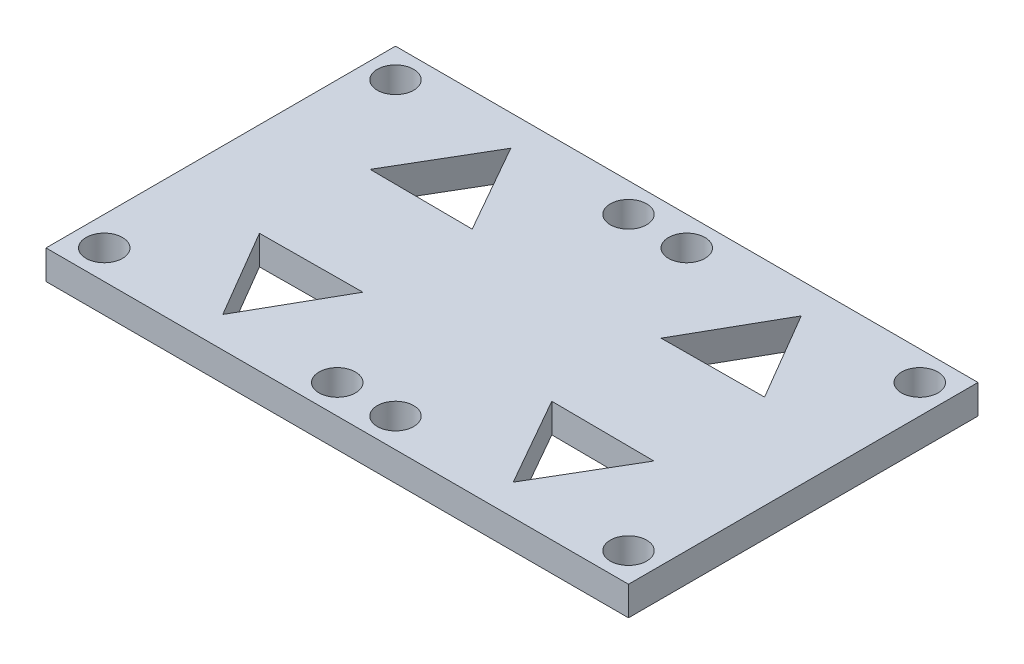
ISO-10303-21;
HEADER;
FILE_DESCRIPTION(('STEP AP214'),'2;1');
FILE_NAME('part.step','',(''),(''),'','','');
FILE_SCHEMA(('AUTOMOTIVE_DESIGN { 1 0 10303 214 1 1 1 1 }'));
ENDSEC;
DATA;
#1=APPLICATION_CONTEXT('core data for automotive mechanical design processes');
#2=APPLICATION_PROTOCOL_DEFINITION('international standard','automotive_design',2000,#1);
#3=PRODUCT_CONTEXT('',#1,'mechanical');
#4=PRODUCT('Part','Part','',(#3));
#5=PRODUCT_RELATED_PRODUCT_CATEGORY('part','',(#4));
#6=PRODUCT_DEFINITION_FORMATION('','',#4);
#7=PRODUCT_DEFINITION_CONTEXT('part definition',#1,'design');
#8=PRODUCT_DEFINITION('design','',#6,#7);
#9=PRODUCT_DEFINITION_SHAPE('','',#8);
#10=(LENGTH_UNIT() NAMED_UNIT(*) SI_UNIT(.MILLI.,.METRE.));
#11=(NAMED_UNIT(*) PLANE_ANGLE_UNIT() SI_UNIT($,.RADIAN.));
#12=(NAMED_UNIT(*) SI_UNIT($,.STERADIAN.) SOLID_ANGLE_UNIT());
#13=UNCERTAINTY_MEASURE_WITH_UNIT(LENGTH_MEASURE(1.E-05),#10,'distance_accuracy_value','');
#14=(GEOMETRIC_REPRESENTATION_CONTEXT(3) GLOBAL_UNCERTAINTY_ASSIGNED_CONTEXT((#13)) GLOBAL_UNIT_ASSIGNED_CONTEXT((#10,
#11,#12)) REPRESENTATION_CONTEXT('',''));
#15=CARTESIAN_POINT('',(0.,0.,0.));
#16=DIRECTION('',(0.,0.,1.));
#17=DIRECTION('',(1.,0.,0.));
#18=AXIS2_PLACEMENT_3D('',#15,#16,#17);
#19=CARTESIAN_POINT('',(0.,25.4,0.));
#20=DIRECTION('',(0.,1.,0.));
#21=DIRECTION('',(0.,0.,1.));
#22=AXIS2_PLACEMENT_3D('',#19,#20,#21);
#23=PLANE('',#22);
#24=DIRECTION('',(0.999976444711515,0.,0.00686367409755204));
#25=VECTOR('',#24,1.);
#26=CARTESIAN_POINT('',(-44.9979325770253,25.4,-48.262777111528));
#27=LINE('',#26,#25);
#28=CARTESIAN_POINT('',(-44.9979325770253,25.4,-48.262777111528));
#29=VERTEX_POINT('',#28);
#30=CARTESIAN_POINT('',(44.6427013174538,25.4,-47.6474985215136));
#31=VERTEX_POINT('',#30);
#32=EDGE_CURVE('E256',#29,#31,#27,.T.);
#33=ORIENTED_EDGE('',*,*,#32,.F.);
#34=DIRECTION('',(-0.505932338487535,0.,0.862573167257441));
#35=VECTOR('',#34,1.);
#36=CARTESIAN_POINT('',(0.355231259571421,25.4,-125.58620398048));
#37=LINE('',#36,#35);
#38=CARTESIAN_POINT('',(0.355231259571421,25.4,-125.58620398048));
#39=VERTEX_POINT('',#38);
#40=EDGE_CURVE('E263',#39,#29,#37,.T.);
#41=ORIENTED_EDGE('',*,*,#40,.F.);
#42=DIRECTION('',(-0.49404410622398,0.,-0.869436841354994));
#43=VECTOR('',#42,1.);
#44=CARTESIAN_POINT('',(44.6427013174538,25.4,-47.6474985215136));
#45=LINE('',#44,#43);
#46=EDGE_CURVE('E271',#31,#39,#45,.T.);
#47=ORIENTED_EDGE('',*,*,#46,.F.);
#48=EDGE_LOOP('',(#33,#41,#47));
#49=FACE_BOUND('',#48,.T.);
#50=DIRECTION('',(-1.,0.,0.));
#51=VECTOR('',#50,1.);
#52=CARTESIAN_POINT('',(0.,25.4,152.4));
#53=LINE('',#52,#51);
#54=CARTESIAN_POINT('',(381.,25.4,152.4));
#55=VERTEX_POINT('',#54);
#56=CARTESIAN_POINT('',(-127.,25.4,152.4));
#57=VERTEX_POINT('',#56);
#58=EDGE_CURVE('E313',#55,#57,#53,.T.);
#59=ORIENTED_EDGE('',*,*,#58,.F.);
#60=DIRECTION('',(0.,0.,-1.));
#61=VECTOR('',#60,1.);
#62=CARTESIAN_POINT('',(381.,25.4,-152.4));
#63=LINE('',#62,#61);
#64=CARTESIAN_POINT('',(381.,25.4,-152.4));
#65=VERTEX_POINT('',#64);
#66=EDGE_CURVE('E220',#55,#65,#63,.T.);
#67=ORIENTED_EDGE('',*,*,#66,.T.);
#68=DIRECTION('',(-1.,0.,0.));
#69=VECTOR('',#68,1.);
#70=CARTESIAN_POINT('',(0.,25.4,-152.4));
#71=LINE('',#70,#69);
#72=CARTESIAN_POINT('',(-127.,25.4,-152.4));
#73=VERTEX_POINT('',#72);
#74=EDGE_CURVE('E11',#65,#73,#71,.T.);
#75=ORIENTED_EDGE('',*,*,#74,.T.);
#76=DIRECTION('',(0.,0.,-1.));
#77=VECTOR('',#76,1.);
#78=CARTESIAN_POINT('',(-127.,25.4,-152.4));
#79=LINE('',#78,#77);
#80=EDGE_CURVE('E298',#57,#73,#79,.T.);
#81=ORIENTED_EDGE('',*,*,#80,.F.);
#82=EDGE_LOOP('',(#59,#67,#75,#81));
#83=FACE_BOUND('',#82,.T.);
#84=CARTESIAN_POINT('',(101.6,25.4,-127.));
#85=DIRECTION('',(0.,1.,0.));
#86=DIRECTION('',(0.,0.,1.));
#87=AXIS2_PLACEMENT_3D('',#84,#85,#86);
#88=CIRCLE('',#87,15.875);
#89=CARTESIAN_POINT('',(101.6,25.4,-111.125));
#90=VERTEX_POINT('',#89);
#91=EDGE_CURVE('E317',#90,#90,#88,.T.);
#92=ORIENTED_EDGE('',*,*,#91,.F.);
#93=EDGE_LOOP('',(#92));
#94=FACE_BOUND('',#93,.T.);
#95=CARTESIAN_POINT('',(101.6,25.4,127.));
#96=DIRECTION('',(0.,-1.,0.));
#97=DIRECTION('',(0.,0.,-1.));
#98=AXIS2_PLACEMENT_3D('',#95,#96,#97);
#99=CIRCLE('',#98,15.875);
#100=CARTESIAN_POINT('',(101.6,25.4,111.125));
#101=VERTEX_POINT('',#100);
#102=EDGE_CURVE('E307',#101,#101,#99,.T.);
#103=ORIENTED_EDGE('',*,*,#102,.T.);
#104=EDGE_LOOP('',(#103));
#105=FACE_BOUND('',#104,.T.);
#106=CARTESIAN_POINT('',(-101.6,25.4,-127.));
#107=DIRECTION('',(0.,-1.,0.));
#108=DIRECTION('',(0.,0.,1.));
#109=AXIS2_PLACEMENT_3D('',#106,#107,#108);
#110=CIRCLE('',#109,15.875);
#111=CARTESIAN_POINT('',(-101.6,25.4,-111.125));
#112=VERTEX_POINT('',#111);
#113=EDGE_CURVE('E292',#112,#112,#110,.T.);
#114=ORIENTED_EDGE('',*,*,#113,.T.);
#115=EDGE_LOOP('',(#114));
#116=FACE_BOUND('',#115,.T.);
#117=CARTESIAN_POINT('',(-101.6,25.4,127.));
#118=DIRECTION('',(0.,1.,0.));
#119=DIRECTION('',(0.,0.,-1.));
#120=AXIS2_PLACEMENT_3D('',#117,#118,#119);
#121=CIRCLE('',#120,15.875);
#122=CARTESIAN_POINT('',(-101.6,25.4,111.125));
#123=VERTEX_POINT('',#122);
#124=EDGE_CURVE('E283',#123,#123,#121,.T.);
#125=ORIENTED_EDGE('',*,*,#124,.F.);
#126=EDGE_LOOP('',(#125));
#127=FACE_BOUND('',#126,.T.);
#128=DIRECTION('',(-0.505932338487535,0.,-0.862573167257441));
#129=VECTOR('',#128,1.);
#130=CARTESIAN_POINT('',(0.355231259571421,25.4,125.58620398048));
#131=LINE('',#130,#129);
#132=CARTESIAN_POINT('',(0.355231259571421,25.4,125.58620398048));
#133=VERTEX_POINT('',#132);
#134=CARTESIAN_POINT('',(-44.9979325770253,25.4,48.262777111528));
#135=VERTEX_POINT('',#134);
#136=EDGE_CURVE('E249',#133,#135,#131,.T.);
#137=ORIENTED_EDGE('',*,*,#136,.T.);
#138=DIRECTION('',(0.999976444711515,0.,-0.00686367409755204));
#139=VECTOR('',#138,1.);
#140=CARTESIAN_POINT('',(-44.9979325770253,25.4,48.262777111528));
#141=LINE('',#140,#139);
#142=CARTESIAN_POINT('',(44.6427013174538,25.4,47.6474985215136));
#143=VERTEX_POINT('',#142);
#144=EDGE_CURVE('E48',#135,#143,#141,.T.);
#145=ORIENTED_EDGE('',*,*,#144,.T.);
#146=DIRECTION('',(-0.49404410622398,0.,0.869436841354994));
#147=VECTOR('',#146,1.);
#148=CARTESIAN_POINT('',(44.6427013174538,25.4,47.6474985215136));
#149=LINE('',#148,#147);
#150=EDGE_CURVE('E243',#143,#133,#149,.T.);
#151=ORIENTED_EDGE('',*,*,#150,.T.);
#152=EDGE_LOOP('',(#137,#145,#151));
#153=FACE_BOUND('',#152,.T.);
#154=DIRECTION('',(-0.999976444711515,0.,0.00686367409755204));
#155=VECTOR('',#154,1.);
#156=CARTESIAN_POINT('',(298.997932577025,25.4,-48.262777111528));
#157=LINE('',#156,#155);
#158=CARTESIAN_POINT('',(298.997932577025,25.4,-48.262777111528));
#159=VERTEX_POINT('',#158);
#160=CARTESIAN_POINT('',(209.357298682546,25.4,-47.6474985215136));
#161=VERTEX_POINT('',#160);
#162=EDGE_CURVE('E179',#159,#161,#157,.T.);
#163=ORIENTED_EDGE('',*,*,#162,.T.);
#164=DIRECTION('',(0.49404410622398,0.,-0.869436841354994));
#165=VECTOR('',#164,1.);
#166=CARTESIAN_POINT('',(209.357298682546,25.4,-47.6474985215136));
#167=LINE('',#166,#165);
#168=CARTESIAN_POINT('',(253.644768740429,25.4,-125.58620398048));
#169=VERTEX_POINT('',#168);
#170=EDGE_CURVE('E194',#161,#169,#167,.T.);
#171=ORIENTED_EDGE('',*,*,#170,.T.);
#172=DIRECTION('',(0.505932338487535,0.,0.862573167257441));
#173=VECTOR('',#172,1.);
#174=CARTESIAN_POINT('',(253.644768740429,25.4,-125.58620398048));
#175=LINE('',#174,#173);
#176=EDGE_CURVE('E185',#169,#159,#175,.T.);
#177=ORIENTED_EDGE('',*,*,#176,.T.);
#178=EDGE_LOOP('',(#163,#171,#177));
#179=FACE_BOUND('',#178,.T.);
#180=CARTESIAN_POINT('',(152.4,25.4,-127.));
#181=DIRECTION('',(0.,-1.,0.));
#182=DIRECTION('',(0.,0.,1.));
#183=AXIS2_PLACEMENT_3D('',#180,#181,#182);
#184=CIRCLE('',#183,15.875);
#185=CARTESIAN_POINT('',(152.4,25.4,-111.125));
#186=VERTEX_POINT('',#185);
#187=EDGE_CURVE('E235',#186,#186,#184,.T.);
#188=ORIENTED_EDGE('',*,*,#187,.T.);
#189=EDGE_LOOP('',(#188));
#190=FACE_BOUND('',#189,.T.);
#191=CARTESIAN_POINT('',(152.4,25.4,127.));
#192=DIRECTION('',(0.,1.,0.));
#193=DIRECTION('',(0.,0.,-1.));
#194=AXIS2_PLACEMENT_3D('',#191,#192,#193);
#195=CIRCLE('',#194,15.875);
#196=CARTESIAN_POINT('',(152.4,25.4,111.125));
#197=VERTEX_POINT('',#196);
#198=EDGE_CURVE('E229',#197,#197,#195,.T.);
#199=ORIENTED_EDGE('',*,*,#198,.F.);
#200=EDGE_LOOP('',(#199));
#201=FACE_BOUND('',#200,.T.);
#202=CARTESIAN_POINT('',(355.6,25.4,-127.));
#203=DIRECTION('',(0.,1.,0.));
#204=DIRECTION('',(0.,0.,1.));
#205=AXIS2_PLACEMENT_3D('',#202,#203,#204);
#206=CIRCLE('',#205,15.875);
#207=CARTESIAN_POINT('',(355.6,25.4,-111.125));
#208=VERTEX_POINT('',#207);
#209=EDGE_CURVE('E214',#208,#208,#206,.T.);
#210=ORIENTED_EDGE('',*,*,#209,.F.);
#211=EDGE_LOOP('',(#210));
#212=FACE_BOUND('',#211,.T.);
#213=CARTESIAN_POINT('',(355.6,25.4,127.));
#214=DIRECTION('',(0.,-1.,0.));
#215=DIRECTION('',(0.,0.,-1.));
#216=AXIS2_PLACEMENT_3D('',#213,#214,#215);
#217=CIRCLE('',#216,15.875);
#218=CARTESIAN_POINT('',(355.6,25.4,111.125));
#219=VERTEX_POINT('',#218);
#220=EDGE_CURVE('E205',#219,#219,#217,.T.);
#221=ORIENTED_EDGE('',*,*,#220,.T.);
#222=EDGE_LOOP('',(#221));
#223=FACE_BOUND('',#222,.T.);
#224=DIRECTION('',(0.505932338487535,0.,-0.862573167257441));
#225=VECTOR('',#224,1.);
#226=CARTESIAN_POINT('',(253.644768740429,25.4,125.58620398048));
#227=LINE('',#226,#225);
#228=CARTESIAN_POINT('',(253.644768740429,25.4,125.58620398048));
#229=VERTEX_POINT('',#228);
#230=CARTESIAN_POINT('',(298.997932577025,25.4,48.262777111528));
#231=VERTEX_POINT('',#230);
#232=EDGE_CURVE('E153',#229,#231,#227,.T.);
#233=ORIENTED_EDGE('',*,*,#232,.F.);
#234=DIRECTION('',(0.49404410622398,0.,0.869436841354994));
#235=VECTOR('',#234,1.);
#236=CARTESIAN_POINT('',(209.357298682546,25.4,47.6474985215136));
#237=LINE('',#236,#235);
#238=CARTESIAN_POINT('',(209.357298682546,25.4,47.6474985215136));
#239=VERTEX_POINT('',#238);
#240=EDGE_CURVE('E169',#239,#229,#237,.T.);
#241=ORIENTED_EDGE('',*,*,#240,.F.);
#242=DIRECTION('',(-0.999976444711515,0.,-0.00686367409755204));
#243=VECTOR('',#242,1.);
#244=CARTESIAN_POINT('',(298.997932577025,25.4,48.262777111528));
#245=LINE('',#244,#243);
#246=EDGE_CURVE('E175',#231,#239,#245,.T.);
#247=ORIENTED_EDGE('',*,*,#246,.F.);
#248=EDGE_LOOP('',(#233,#241,#247));
#249=FACE_BOUND('',#248,.T.);
#250=ADVANCED_FACE('F33',(#49,#83,#94,#105,#116,#127,#153,#179,#190,#201,#212,#223,#249),#23,.T.);
#251=CARTESIAN_POINT('',(0.,0.,0.));
#252=DIRECTION('',(0.,1.,0.));
#253=DIRECTION('',(0.,0.,1.));
#254=AXIS2_PLACEMENT_3D('',#251,#252,#253);
#255=PLANE('',#254);
#256=CARTESIAN_POINT('',(-101.6,0.,127.));
#257=DIRECTION('',(0.,1.,0.));
#258=DIRECTION('',(0.,0.,-1.));
#259=AXIS2_PLACEMENT_3D('',#256,#257,#258);
#260=CIRCLE('',#259,15.875);
#261=CARTESIAN_POINT('',(-101.6,0.,111.125));
#262=VERTEX_POINT('',#261);
#263=EDGE_CURVE('E278',#262,#262,#260,.T.);
#264=ORIENTED_EDGE('',*,*,#263,.T.);
#265=EDGE_LOOP('',(#264));
#266=FACE_BOUND('',#265,.T.);
#267=CARTESIAN_POINT('',(-101.6,0.,-127.));
#268=DIRECTION('',(0.,-1.,0.));
#269=DIRECTION('',(0.,0.,1.));
#270=AXIS2_PLACEMENT_3D('',#267,#268,#269);
#271=CIRCLE('',#270,15.875);
#272=CARTESIAN_POINT('',(-101.6,0.,-111.125));
#273=VERTEX_POINT('',#272);
#274=EDGE_CURVE('E291',#273,#273,#271,.T.);
#275=ORIENTED_EDGE('',*,*,#274,.F.);
#276=EDGE_LOOP('',(#275));
#277=FACE_BOUND('',#276,.T.);
#278=CARTESIAN_POINT('',(101.6,0.,127.));
#279=DIRECTION('',(0.,-1.,0.));
#280=DIRECTION('',(0.,0.,-1.));
#281=AXIS2_PLACEMENT_3D('',#278,#279,#280);
#282=CIRCLE('',#281,15.875);
#283=CARTESIAN_POINT('',(101.6,0.,111.125));
#284=VERTEX_POINT('',#283);
#285=EDGE_CURVE('E306',#284,#284,#282,.T.);
#286=ORIENTED_EDGE('',*,*,#285,.F.);
#287=EDGE_LOOP('',(#286));
#288=FACE_BOUND('',#287,.T.);
#289=CARTESIAN_POINT('',(101.6,0.,-127.));
#290=DIRECTION('',(0.,1.,0.));
#291=DIRECTION('',(0.,0.,1.));
#292=AXIS2_PLACEMENT_3D('',#289,#290,#291);
#293=CIRCLE('',#292,15.875);
#294=CARTESIAN_POINT('',(101.6,0.,-111.125));
#295=VERTEX_POINT('',#294);
#296=EDGE_CURVE('E315',#295,#295,#293,.T.);
#297=ORIENTED_EDGE('',*,*,#296,.T.);
#298=EDGE_LOOP('',(#297));
#299=FACE_BOUND('',#298,.T.);
#300=DIRECTION('',(-1.,0.,0.));
#301=VECTOR('',#300,1.);
#302=CARTESIAN_POINT('',(0.,0.,-152.4));
#303=LINE('',#302,#301);
#304=CARTESIAN_POINT('',(381.,0.,-152.4));
#305=VERTEX_POINT('',#304);
#306=CARTESIAN_POINT('',(-127.,0.,-152.4));
#307=VERTEX_POINT('',#306);
#308=EDGE_CURVE('E37',#305,#307,#303,.T.);
#309=ORIENTED_EDGE('',*,*,#308,.F.);
#310=DIRECTION('',(0.,0.,-1.));
#311=VECTOR('',#310,1.);
#312=CARTESIAN_POINT('',(381.,0.,-152.4));
#313=LINE('',#312,#311);
#314=CARTESIAN_POINT('',(381.,0.,152.4));
#315=VERTEX_POINT('',#314);
#316=EDGE_CURVE('E217',#315,#305,#313,.T.);
#317=ORIENTED_EDGE('',*,*,#316,.F.);
#318=DIRECTION('',(-1.,0.,0.));
#319=VECTOR('',#318,1.);
#320=CARTESIAN_POINT('',(0.,0.,152.4));
#321=LINE('',#320,#319);
#322=CARTESIAN_POINT('',(-127.,0.,152.4));
#323=VERTEX_POINT('',#322);
#324=EDGE_CURVE('E310',#315,#323,#321,.T.);
#325=ORIENTED_EDGE('',*,*,#324,.T.);
#326=DIRECTION('',(0.,0.,-1.));
#327=VECTOR('',#326,1.);
#328=CARTESIAN_POINT('',(-127.,0.,-152.4));
#329=LINE('',#328,#327);
#330=EDGE_CURVE('E295',#323,#307,#329,.T.);
#331=ORIENTED_EDGE('',*,*,#330,.T.);
#332=EDGE_LOOP('',(#309,#317,#325,#331));
#333=FACE_BOUND('',#332,.T.);
#334=DIRECTION('',(-0.505932338487535,0.,0.862573167257441));
#335=VECTOR('',#334,1.);
#336=CARTESIAN_POINT('',(0.355231259571421,0.,-125.58620398048));
#337=LINE('',#336,#335);
#338=CARTESIAN_POINT('',(0.355231259571417,0.,-125.58620398048));
#339=VERTEX_POINT('',#338);
#340=CARTESIAN_POINT('',(-44.9979325770253,0.,-48.262777111528));
#341=VERTEX_POINT('',#340);
#342=EDGE_CURVE('E266',#339,#341,#337,.T.);
#343=ORIENTED_EDGE('',*,*,#342,.T.);
#344=DIRECTION('',(0.999976444711515,0.,0.00686367409755204));
#345=VECTOR('',#344,1.);
#346=CARTESIAN_POINT('',(-44.9979325770253,0.,-48.262777111528));
#347=LINE('',#346,#345);
#348=CARTESIAN_POINT('',(44.6427013174538,0.,-47.6474985215136));
#349=VERTEX_POINT('',#348);
#350=EDGE_CURVE('E259',#341,#349,#347,.T.);
#351=ORIENTED_EDGE('',*,*,#350,.T.);
#352=DIRECTION('',(-0.49404410622398,0.,-0.869436841354994));
#353=VECTOR('',#352,1.);
#354=CARTESIAN_POINT('',(44.6427013174538,0.,-47.6474985215136));
#355=LINE('',#354,#353);
#356=EDGE_CURVE('E262',#349,#339,#355,.T.);
#357=ORIENTED_EDGE('',*,*,#356,.T.);
#358=EDGE_LOOP('',(#343,#351,#357));
#359=FACE_BOUND('',#358,.T.);
#360=DIRECTION('',(0.999976444711515,0.,-0.00686367409755204));
#361=VECTOR('',#360,1.);
#362=CARTESIAN_POINT('',(-44.9979325770253,0.,48.262777111528));
#363=LINE('',#362,#361);
#364=CARTESIAN_POINT('',(-44.9979325770253,0.,48.262777111528));
#365=VERTEX_POINT('',#364);
#366=CARTESIAN_POINT('',(44.6427013174538,0.,47.6474985215136));
#367=VERTEX_POINT('',#366);
#368=EDGE_CURVE('E240',#365,#367,#363,.T.);
#369=ORIENTED_EDGE('',*,*,#368,.F.);
#370=DIRECTION('',(-0.505932338487535,0.,-0.862573167257441));
#371=VECTOR('',#370,1.);
#372=CARTESIAN_POINT('',(0.355231259571421,0.,125.58620398048));
#373=LINE('',#372,#371);
#374=CARTESIAN_POINT('',(0.355231259571424,0.,125.58620398048));
#375=VERTEX_POINT('',#374);
#376=EDGE_CURVE('E242',#375,#365,#373,.T.);
#377=ORIENTED_EDGE('',*,*,#376,.F.);
#378=DIRECTION('',(-0.49404410622398,0.,0.869436841354994));
#379=VECTOR('',#378,1.);
#380=CARTESIAN_POINT('',(44.6427013174538,0.,47.6474985215136));
#381=LINE('',#380,#379);
#382=EDGE_CURVE('E245',#367,#375,#381,.T.);
#383=ORIENTED_EDGE('',*,*,#382,.F.);
#384=EDGE_LOOP('',(#369,#377,#383));
#385=FACE_BOUND('',#384,.T.);
#386=CARTESIAN_POINT('',(355.6,0.,127.));
#387=DIRECTION('',(0.,-1.,0.));
#388=DIRECTION('',(0.,0.,-1.));
#389=AXIS2_PLACEMENT_3D('',#386,#387,#388);
#390=CIRCLE('',#389,15.875);
#391=CARTESIAN_POINT('',(355.6,0.,111.125));
#392=VERTEX_POINT('',#391);
#393=EDGE_CURVE('E201',#392,#392,#390,.T.);
#394=ORIENTED_EDGE('',*,*,#393,.F.);
#395=EDGE_LOOP('',(#394));
#396=FACE_BOUND('',#395,.T.);
#397=CARTESIAN_POINT('',(355.6,0.,-127.));
#398=DIRECTION('',(0.,1.,0.));
#399=DIRECTION('',(0.,0.,1.));
#400=AXIS2_PLACEMENT_3D('',#397,#398,#399);
#401=CIRCLE('',#400,15.875);
#402=CARTESIAN_POINT('',(355.6,0.,-111.125));
#403=VERTEX_POINT('',#402);
#404=EDGE_CURVE('E213',#403,#403,#401,.T.);
#405=ORIENTED_EDGE('',*,*,#404,.T.);
#406=EDGE_LOOP('',(#405));
#407=FACE_BOUND('',#406,.T.);
#408=CARTESIAN_POINT('',(152.4,0.,127.));
#409=DIRECTION('',(0.,1.,0.));
#410=DIRECTION('',(0.,0.,-1.));
#411=AXIS2_PLACEMENT_3D('',#408,#409,#410);
#412=CIRCLE('',#411,15.875);
#413=CARTESIAN_POINT('',(152.4,0.,111.125));
#414=VERTEX_POINT('',#413);
#415=EDGE_CURVE('E228',#414,#414,#412,.T.);
#416=ORIENTED_EDGE('',*,*,#415,.T.);
#417=EDGE_LOOP('',(#416));
#418=FACE_BOUND('',#417,.T.);
#419=CARTESIAN_POINT('',(152.4,0.,-127.));
#420=DIRECTION('',(0.,-1.,0.));
#421=DIRECTION('',(0.,0.,1.));
#422=AXIS2_PLACEMENT_3D('',#419,#420,#421);
#423=CIRCLE('',#422,15.875);
#424=CARTESIAN_POINT('',(152.4,0.,-111.125));
#425=VERTEX_POINT('',#424);
#426=EDGE_CURVE('E232',#425,#425,#423,.T.);
#427=ORIENTED_EDGE('',*,*,#426,.F.);
#428=EDGE_LOOP('',(#427));
#429=FACE_BOUND('',#428,.T.);
#430=DIRECTION('',(0.505932338487535,0.,0.862573167257441));
#431=VECTOR('',#430,1.);
#432=CARTESIAN_POINT('',(253.644768740429,0.,-125.58620398048));
#433=LINE('',#432,#431);
#434=CARTESIAN_POINT('',(253.644768740429,0.,-125.58620398048));
#435=VERTEX_POINT('',#434);
#436=CARTESIAN_POINT('',(298.997932577025,0.,-48.262777111528));
#437=VERTEX_POINT('',#436);
#438=EDGE_CURVE('E188',#435,#437,#433,.T.);
#439=ORIENTED_EDGE('',*,*,#438,.F.);
#440=DIRECTION('',(0.49404410622398,0.,-0.869436841354994));
#441=VECTOR('',#440,1.);
#442=CARTESIAN_POINT('',(209.357298682546,0.,-47.6474985215136));
#443=LINE('',#442,#441);
#444=CARTESIAN_POINT('',(209.357298682546,0.,-47.6474985215136));
#445=VERTEX_POINT('',#444);
#446=EDGE_CURVE('E184',#445,#435,#443,.T.);
#447=ORIENTED_EDGE('',*,*,#446,.F.);
#448=DIRECTION('',(-0.999976444711515,0.,0.00686367409755204));
#449=VECTOR('',#448,1.);
#450=CARTESIAN_POINT('',(298.997932577025,0.,-48.262777111528));
#451=LINE('',#450,#449);
#452=EDGE_CURVE('E181',#437,#445,#451,.T.);
#453=ORIENTED_EDGE('',*,*,#452,.F.);
#454=EDGE_LOOP('',(#439,#447,#453));
#455=FACE_BOUND('',#454,.T.);
#456=DIRECTION('',(-0.999976444711515,0.,-0.00686367409755204));
#457=VECTOR('',#456,1.);
#458=CARTESIAN_POINT('',(298.997932577025,0.,48.262777111528));
#459=LINE('',#458,#457);
#460=CARTESIAN_POINT('',(298.997932577025,0.,48.262777111528));
#461=VERTEX_POINT('',#460);
#462=CARTESIAN_POINT('',(209.357298682546,0.,47.6474985215136));
#463=VERTEX_POINT('',#462);
#464=EDGE_CURVE('E164',#461,#463,#459,.T.);
#465=ORIENTED_EDGE('',*,*,#464,.T.);
#466=DIRECTION('',(0.49404410622398,0.,0.869436841354994));
#467=VECTOR('',#466,1.);
#468=CARTESIAN_POINT('',(209.357298682546,0.,47.6474985215136));
#469=LINE('',#468,#467);
#470=CARTESIAN_POINT('',(253.644768740429,0.,125.58620398048));
#471=VERTEX_POINT('',#470);
#472=EDGE_CURVE('E159',#463,#471,#469,.T.);
#473=ORIENTED_EDGE('',*,*,#472,.T.);
#474=DIRECTION('',(0.505932338487535,0.,-0.862573167257441));
#475=VECTOR('',#474,1.);
#476=CARTESIAN_POINT('',(253.644768740429,0.,125.58620398048));
#477=LINE('',#476,#475);
#478=EDGE_CURVE('E150',#471,#461,#477,.T.);
#479=ORIENTED_EDGE('',*,*,#478,.T.);
#480=EDGE_LOOP('',(#465,#473,#479));
#481=FACE_BOUND('',#480,.T.);
#482=ADVANCED_FACE('F163',(#266,#277,#288,#299,#333,#359,#385,#396,#407,#418,#429,#455,#481),
#255,.F.);
#483=CARTESIAN_POINT('',(0.,25.4,-152.4));
#484=DIRECTION('',(0.,0.,1.));
#485=DIRECTION('',(1.,0.,0.));
#486=AXIS2_PLACEMENT_3D('',#483,#484,#485);
#487=PLANE('',#486);
#488=ORIENTED_EDGE('',*,*,#308,.T.);
#489=DIRECTION('',(0.,-1.,0.));
#490=VECTOR('',#489,1.);
#491=CARTESIAN_POINT('',(-127.,25.4,-152.4));
#492=LINE('',#491,#490);
#493=EDGE_CURVE('E301',#73,#307,#492,.T.);
#494=ORIENTED_EDGE('',*,*,#493,.F.);
#495=ORIENTED_EDGE('',*,*,#74,.F.);
#496=DIRECTION('',(0.,-1.,0.));
#497=VECTOR('',#496,1.);
#498=CARTESIAN_POINT('',(381.,25.4,-152.4));
#499=LINE('',#498,#497);
#500=EDGE_CURVE('E223',#65,#305,#499,.T.);
#501=ORIENTED_EDGE('',*,*,#500,.T.);
#502=EDGE_LOOP('',(#488,#494,#495,#501));
#503=FACE_BOUND('',#502,.T.);
#504=ADVANCED_FACE('F35',(#503),#487,.F.);
#505=CARTESIAN_POINT('',(101.6,25.4,-127.));
#506=DIRECTION('',(0.,-1.,0.));
#507=DIRECTION('',(0.,0.,-1.));
#508=AXIS2_PLACEMENT_3D('',#505,#506,#507);
#509=CYLINDRICAL_SURFACE('',#508,15.875);
#510=ORIENTED_EDGE('',*,*,#91,.T.);
#511=EDGE_LOOP('',(#510));
#512=FACE_BOUND('',#511,.T.);
#513=ORIENTED_EDGE('',*,*,#296,.F.);
#514=EDGE_LOOP('',(#513));
#515=FACE_BOUND('',#514,.T.);
#516=ADVANCED_FACE('F325',(#512,#515),#509,.F.);
#517=CARTESIAN_POINT('',(0.,25.4,152.4));
#518=DIRECTION('',(0.,0.,1.));
#519=DIRECTION('',(1.,0.,0.));
#520=AXIS2_PLACEMENT_3D('',#517,#518,#519);
#521=PLANE('',#520);
#522=ORIENTED_EDGE('',*,*,#324,.F.);
#523=DIRECTION('',(0.,-1.,0.));
#524=VECTOR('',#523,1.);
#525=CARTESIAN_POINT('',(381.,25.4,152.4));
#526=LINE('',#525,#524);
#527=EDGE_CURVE('E208',#55,#315,#526,.T.);
#528=ORIENTED_EDGE('',*,*,#527,.F.);
#529=ORIENTED_EDGE('',*,*,#58,.T.);
#530=DIRECTION('',(0.,-1.,0.));
#531=VECTOR('',#530,1.);
#532=CARTESIAN_POINT('',(-127.,25.4,152.4));
#533=LINE('',#532,#531);
#534=EDGE_CURVE('E286',#57,#323,#533,.T.);
#535=ORIENTED_EDGE('',*,*,#534,.T.);
#536=EDGE_LOOP('',(#522,#528,#529,#535));
#537=FACE_BOUND('',#536,.T.);
#538=ADVANCED_FACE('F327',(#537),#521,.T.);
#539=CARTESIAN_POINT('',(101.6,25.4,127.));
#540=DIRECTION('',(0.,-1.,0.));
#541=DIRECTION('',(0.,0.,-1.));
#542=AXIS2_PLACEMENT_3D('',#539,#540,#541);
#543=CYLINDRICAL_SURFACE('',#542,15.875);
#544=ORIENTED_EDGE('',*,*,#102,.F.);
#545=EDGE_LOOP('',(#544));
#546=FACE_BOUND('',#545,.T.);
#547=ORIENTED_EDGE('',*,*,#285,.T.);
#548=EDGE_LOOP('',(#547));
#549=FACE_BOUND('',#548,.T.);
#550=ADVANCED_FACE('F334',(#546,#549),#543,.F.);
#551=CARTESIAN_POINT('',(-127.,25.4,-152.4));
#552=DIRECTION('',(1.,0.,0.));
#553=DIRECTION('',(0.,0.,1.));
#554=AXIS2_PLACEMENT_3D('',#551,#552,#553);
#555=PLANE('',#554);
#556=ORIENTED_EDGE('',*,*,#330,.F.);
#557=ORIENTED_EDGE('',*,*,#534,.F.);
#558=ORIENTED_EDGE('',*,*,#80,.T.);
#559=ORIENTED_EDGE('',*,*,#493,.T.);
#560=EDGE_LOOP('',(#556,#557,#558,#559));
#561=FACE_BOUND('',#560,.T.);
#562=ADVANCED_FACE('F444',(#561),#555,.F.);
#563=CARTESIAN_POINT('',(-101.6,25.4,-127.));
#564=DIRECTION('',(0.,-1.,0.));
#565=DIRECTION('',(0.,0.,-1.));
#566=AXIS2_PLACEMENT_3D('',#563,#564,#565);
#567=CYLINDRICAL_SURFACE('',#566,15.875);
#568=ORIENTED_EDGE('',*,*,#113,.F.);
#569=EDGE_LOOP('',(#568));
#570=FACE_BOUND('',#569,.T.);
#571=ORIENTED_EDGE('',*,*,#274,.T.);
#572=EDGE_LOOP('',(#571));
#573=FACE_BOUND('',#572,.T.);
#574=ADVANCED_FACE('F440',(#570,#573),#567,.F.);
#575=CARTESIAN_POINT('',(-101.6,25.4,127.));
#576=DIRECTION('',(0.,-1.,0.));
#577=DIRECTION('',(0.,0.,-1.));
#578=AXIS2_PLACEMENT_3D('',#575,#576,#577);
#579=CYLINDRICAL_SURFACE('',#578,15.875);
#580=ORIENTED_EDGE('',*,*,#124,.T.);
#581=EDGE_LOOP('',(#580));
#582=FACE_BOUND('',#581,.T.);
#583=ORIENTED_EDGE('',*,*,#263,.F.);
#584=EDGE_LOOP('',(#583));
#585=FACE_BOUND('',#584,.T.);
#586=ADVANCED_FACE('F436',(#582,#585),#579,.F.);
#587=CARTESIAN_POINT('',(-44.9979325770253,0.,-48.262777111528));
#588=DIRECTION('',(-0.00686367409755204,0.,0.999976444711515));
#589=DIRECTION('',(0.999976444711516,0.,0.00686367409755204));
#590=AXIS2_PLACEMENT_3D('',#587,#588,#589);
#591=PLANE('',#590);
#592=ORIENTED_EDGE('',*,*,#32,.T.);
#593=DIRECTION('',(0.,1.,0.));
#594=VECTOR('',#593,1.);
#595=CARTESIAN_POINT('',(44.6427013174538,0.,-47.6474985215136));
#596=LINE('',#595,#594);
#597=EDGE_CURVE('E269',#349,#31,#596,.T.);
#598=ORIENTED_EDGE('',*,*,#597,.F.);
#599=ORIENTED_EDGE('',*,*,#350,.F.);
#600=DIRECTION('',(0.,1.,0.));
#601=VECTOR('',#600,1.);
#602=CARTESIAN_POINT('',(-44.9979325770253,0.,-48.262777111528));
#603=LINE('',#602,#601);
#604=EDGE_CURVE('E276',#341,#29,#603,.T.);
#605=ORIENTED_EDGE('',*,*,#604,.T.);
#606=EDGE_LOOP('',(#592,#598,#599,#605));
#607=FACE_BOUND('',#606,.T.);
#608=ADVANCED_FACE('F429',(#607),#591,.F.);
#609=CARTESIAN_POINT('',(0.355231259571421,0.,-125.58620398048));
#610=DIRECTION('',(-0.862573167257441,0.,-0.505932338487536));
#611=DIRECTION('',(-0.505932338487536,0.,0.862573167257441));
#612=AXIS2_PLACEMENT_3D('',#609,#610,#611);
#613=PLANE('',#612);
#614=ORIENTED_EDGE('',*,*,#40,.T.);
#615=ORIENTED_EDGE('',*,*,#604,.F.);
#616=ORIENTED_EDGE('',*,*,#342,.F.);
#617=DIRECTION('',(0.,1.,0.));
#618=VECTOR('',#617,1.);
#619=CARTESIAN_POINT('',(0.355231259571421,0.,-125.58620398048));
#620=LINE('',#619,#618);
#621=EDGE_CURVE('E279',#339,#39,#620,.T.);
#622=ORIENTED_EDGE('',*,*,#621,.T.);
#623=EDGE_LOOP('',(#614,#615,#616,#622));
#624=FACE_BOUND('',#623,.T.);
#625=ADVANCED_FACE('F426',(#624),#613,.F.);
#626=CARTESIAN_POINT('',(44.6427013174538,0.,-47.6474985215136));
#627=DIRECTION('',(0.869436841354994,0.,-0.49404410622398));
#628=DIRECTION('',(-0.49404410622398,0.,-0.869436841354994));
#629=AXIS2_PLACEMENT_3D('',#626,#627,#628);
#630=PLANE('',#629);
#631=ORIENTED_EDGE('',*,*,#46,.T.);
#632=ORIENTED_EDGE('',*,*,#621,.F.);
#633=ORIENTED_EDGE('',*,*,#356,.F.);
#634=ORIENTED_EDGE('',*,*,#597,.T.);
#635=EDGE_LOOP('',(#631,#632,#633,#634));
#636=FACE_BOUND('',#635,.T.);
#637=ADVANCED_FACE('F425',(#636),#630,.F.);
#638=CARTESIAN_POINT('',(-44.9979325770253,0.,48.262777111528));
#639=DIRECTION('',(0.00686367409755204,0.,0.999976444711515));
#640=DIRECTION('',(0.999976444711516,0.,-0.00686367409755204));
#641=AXIS2_PLACEMENT_3D('',#638,#639,#640);
#642=PLANE('',#641);
#643=ORIENTED_EDGE('',*,*,#144,.F.);
#644=DIRECTION('',(0.,1.,0.));
#645=VECTOR('',#644,1.);
#646=CARTESIAN_POINT('',(-44.9979325770253,0.,48.262777111528));
#647=LINE('',#646,#645);
#648=EDGE_CURVE('E247',#365,#135,#647,.T.);
#649=ORIENTED_EDGE('',*,*,#648,.F.);
#650=ORIENTED_EDGE('',*,*,#368,.T.);
#651=DIRECTION('',(0.,1.,0.));
#652=VECTOR('',#651,1.);
#653=CARTESIAN_POINT('',(44.6427013174538,0.,47.6474985215136));
#654=LINE('',#653,#652);
#655=EDGE_CURVE('E254',#367,#143,#654,.T.);
#656=ORIENTED_EDGE('',*,*,#655,.T.);
#657=EDGE_LOOP('',(#643,#649,#650,#656));
#658=FACE_BOUND('',#657,.T.);
#659=ADVANCED_FACE('F419',(#658),#642,.T.);
#660=CARTESIAN_POINT('',(44.6427013174538,0.,47.6474985215136));
#661=DIRECTION('',(-0.869436841354994,0.,-0.49404410622398));
#662=DIRECTION('',(-0.49404410622398,0.,0.869436841354994));
#663=AXIS2_PLACEMENT_3D('',#660,#661,#662);
#664=PLANE('',#663);
#665=ORIENTED_EDGE('',*,*,#150,.F.);
#666=ORIENTED_EDGE('',*,*,#655,.F.);
#667=ORIENTED_EDGE('',*,*,#382,.T.);
#668=DIRECTION('',(0.,1.,0.));
#669=VECTOR('',#668,1.);
#670=CARTESIAN_POINT('',(0.355231259571421,0.,125.58620398048));
#671=LINE('',#670,#669);
#672=EDGE_CURVE('E56',#375,#133,#671,.T.);
#673=ORIENTED_EDGE('',*,*,#672,.T.);
#674=EDGE_LOOP('',(#665,#666,#667,#673));
#675=FACE_BOUND('',#674,.T.);
#676=ADVANCED_FACE('F416',(#675),#664,.T.);
#677=CARTESIAN_POINT('',(0.355231259571421,0.,125.58620398048));
#678=DIRECTION('',(0.862573167257441,0.,-0.505932338487536));
#679=DIRECTION('',(-0.505932338487536,0.,-0.862573167257441));
#680=AXIS2_PLACEMENT_3D('',#677,#678,#679);
#681=PLANE('',#680);
#682=ORIENTED_EDGE('',*,*,#136,.F.);
#683=ORIENTED_EDGE('',*,*,#672,.F.);
#684=ORIENTED_EDGE('',*,*,#376,.T.);
#685=ORIENTED_EDGE('',*,*,#648,.T.);
#686=EDGE_LOOP('',(#682,#683,#684,#685));
#687=FACE_BOUND('',#686,.T.);
#688=ADVANCED_FACE('F414',(#687),#681,.T.);
#689=CARTESIAN_POINT('',(152.4,25.4,-127.));
#690=DIRECTION('',(0.,-1.,0.));
#691=DIRECTION('',(0.,0.,-1.));
#692=AXIS2_PLACEMENT_3D('',#689,#690,#691);
#693=CYLINDRICAL_SURFACE('',#692,15.875);
#694=ORIENTED_EDGE('',*,*,#187,.F.);
#695=EDGE_LOOP('',(#694));
#696=FACE_BOUND('',#695,.T.);
#697=ORIENTED_EDGE('',*,*,#426,.T.);
#698=EDGE_LOOP('',(#697));
#699=FACE_BOUND('',#698,.T.);
#700=ADVANCED_FACE('F410',(#696,#699),#693,.F.);
#701=CARTESIAN_POINT('',(152.4,25.4,127.));
#702=DIRECTION('',(0.,-1.,0.));
#703=DIRECTION('',(0.,0.,-1.));
#704=AXIS2_PLACEMENT_3D('',#701,#702,#703);
#705=CYLINDRICAL_SURFACE('',#704,15.875);
#706=ORIENTED_EDGE('',*,*,#198,.T.);
#707=EDGE_LOOP('',(#706));
#708=FACE_BOUND('',#707,.T.);
#709=ORIENTED_EDGE('',*,*,#415,.F.);
#710=EDGE_LOOP('',(#709));
#711=FACE_BOUND('',#710,.T.);
#712=ADVANCED_FACE('F406',(#708,#711),#705,.F.);
#713=CARTESIAN_POINT('',(381.,25.4,-152.4));
#714=DIRECTION('',(-1.,0.,0.));
#715=DIRECTION('',(0.,0.,1.));
#716=AXIS2_PLACEMENT_3D('',#713,#714,#715);
#717=PLANE('',#716);
#718=ORIENTED_EDGE('',*,*,#316,.T.);
#719=ORIENTED_EDGE('',*,*,#500,.F.);
#720=ORIENTED_EDGE('',*,*,#66,.F.);
#721=ORIENTED_EDGE('',*,*,#527,.T.);
#722=EDGE_LOOP('',(#718,#719,#720,#721));
#723=FACE_BOUND('',#722,.T.);
#724=ADVANCED_FACE('F402',(#723),#717,.F.);
#725=CARTESIAN_POINT('',(355.6,25.4,-127.));
#726=DIRECTION('',(0.,-1.,0.));
#727=DIRECTION('',(0.,0.,-1.));
#728=AXIS2_PLACEMENT_3D('',#725,#726,#727);
#729=CYLINDRICAL_SURFACE('',#728,15.875);
#730=ORIENTED_EDGE('',*,*,#209,.T.);
#731=EDGE_LOOP('',(#730));
#732=FACE_BOUND('',#731,.T.);
#733=ORIENTED_EDGE('',*,*,#404,.F.);
#734=EDGE_LOOP('',(#733));
#735=FACE_BOUND('',#734,.T.);
#736=ADVANCED_FACE('F398',(#732,#735),#729,.F.);
#737=CARTESIAN_POINT('',(355.6,25.4,127.));
#738=DIRECTION('',(0.,-1.,0.));
#739=DIRECTION('',(0.,0.,-1.));
#740=AXIS2_PLACEMENT_3D('',#737,#738,#739);
#741=CYLINDRICAL_SURFACE('',#740,15.875);
#742=ORIENTED_EDGE('',*,*,#220,.F.);
#743=EDGE_LOOP('',(#742));
#744=FACE_BOUND('',#743,.T.);
#745=ORIENTED_EDGE('',*,*,#393,.T.);
#746=EDGE_LOOP('',(#745));
#747=FACE_BOUND('',#746,.T.);
#748=ADVANCED_FACE('F394',(#744,#747),#741,.F.);
#749=CARTESIAN_POINT('',(298.997932577025,0.,-48.262777111528));
#750=DIRECTION('',(0.00686367409755204,0.,0.999976444711515));
#751=DIRECTION('',(-0.999976444711516,0.,0.00686367409755204));
#752=AXIS2_PLACEMENT_3D('',#749,#750,#751);
#753=PLANE('',#752);
#754=ORIENTED_EDGE('',*,*,#162,.F.);
#755=DIRECTION('',(0.,1.,0.));
#756=VECTOR('',#755,1.);
#757=CARTESIAN_POINT('',(298.997932577025,0.,-48.262777111528));
#758=LINE('',#757,#756);
#759=EDGE_CURVE('E199',#437,#159,#758,.T.);
#760=ORIENTED_EDGE('',*,*,#759,.F.);
#761=ORIENTED_EDGE('',*,*,#452,.T.);
#762=DIRECTION('',(0.,1.,0.));
#763=VECTOR('',#762,1.);
#764=CARTESIAN_POINT('',(209.357298682546,0.,-47.6474985215136));
#765=LINE('',#764,#763);
#766=EDGE_CURVE('E191',#445,#161,#765,.T.);
#767=ORIENTED_EDGE('',*,*,#766,.T.);
#768=EDGE_LOOP('',(#754,#760,#761,#767));
#769=FACE_BOUND('',#768,.T.);
#770=ADVANCED_FACE('F387',(#769),#753,.F.);
#771=CARTESIAN_POINT('',(253.644768740429,0.,-125.58620398048));
#772=DIRECTION('',(0.862573167257441,0.,-0.505932338487536));
#773=DIRECTION('',(0.505932338487536,0.,0.862573167257441));
#774=AXIS2_PLACEMENT_3D('',#771,#772,#773);
#775=PLANE('',#774);
#776=ORIENTED_EDGE('',*,*,#176,.F.);
#777=DIRECTION('',(0.,1.,0.));
#778=VECTOR('',#777,1.);
#779=CARTESIAN_POINT('',(253.644768740429,0.,-125.58620398048));
#780=LINE('',#779,#778);
#781=EDGE_CURVE('E202',#435,#169,#780,.T.);
#782=ORIENTED_EDGE('',*,*,#781,.F.);
#783=ORIENTED_EDGE('',*,*,#438,.T.);
#784=ORIENTED_EDGE('',*,*,#759,.T.);
#785=EDGE_LOOP('',(#776,#782,#783,#784));
#786=FACE_BOUND('',#785,.T.);
#787=ADVANCED_FACE('F384',(#786),#775,.F.);
#788=CARTESIAN_POINT('',(209.357298682546,0.,-47.6474985215136));
#789=DIRECTION('',(-0.869436841354994,0.,-0.49404410622398));
#790=DIRECTION('',(0.49404410622398,0.,-0.869436841354994));
#791=AXIS2_PLACEMENT_3D('',#788,#789,#790);
#792=PLANE('',#791);
#793=ORIENTED_EDGE('',*,*,#170,.F.);
#794=ORIENTED_EDGE('',*,*,#766,.F.);
#795=ORIENTED_EDGE('',*,*,#446,.T.);
#796=ORIENTED_EDGE('',*,*,#781,.T.);
#797=EDGE_LOOP('',(#793,#794,#795,#796));
#798=FACE_BOUND('',#797,.T.);
#799=ADVANCED_FACE('F381',(#798),#792,.F.);
#800=CARTESIAN_POINT('',(298.997932577025,0.,48.262777111528));
#801=DIRECTION('',(-0.00686367409755204,0.,0.999976444711515));
#802=DIRECTION('',(-0.999976444711516,0.,-0.00686367409755204));
#803=AXIS2_PLACEMENT_3D('',#800,#801,#802);
#804=PLANE('',#803);
#805=ORIENTED_EDGE('',*,*,#246,.T.);
#806=DIRECTION('',(0.,1.,0.));
#807=VECTOR('',#806,1.);
#808=CARTESIAN_POINT('',(209.357298682546,0.,47.6474985215136));
#809=LINE('',#808,#807);
#810=EDGE_CURVE('E168',#463,#239,#809,.T.);
#811=ORIENTED_EDGE('',*,*,#810,.F.);
#812=ORIENTED_EDGE('',*,*,#464,.F.);
#813=DIRECTION('',(0.,1.,0.));
#814=VECTOR('',#813,1.);
#815=CARTESIAN_POINT('',(298.997932577025,0.,48.262777111528));
#816=LINE('',#815,#814);
#817=EDGE_CURVE('E147',#461,#231,#816,.T.);
#818=ORIENTED_EDGE('',*,*,#817,.T.);
#819=EDGE_LOOP('',(#805,#811,#812,#818));
#820=FACE_BOUND('',#819,.T.);
#821=ADVANCED_FACE('F167',(#820),#804,.T.);
#822=CARTESIAN_POINT('',(209.357298682546,0.,47.6474985215136));
#823=DIRECTION('',(0.869436841354994,0.,-0.49404410622398));
#824=DIRECTION('',(0.49404410622398,0.,0.869436841354994));
#825=AXIS2_PLACEMENT_3D('',#822,#823,#824);
#826=PLANE('',#825);
#827=ORIENTED_EDGE('',*,*,#240,.T.);
#828=DIRECTION('',(0.,1.,0.));
#829=VECTOR('',#828,1.);
#830=CARTESIAN_POINT('',(253.644768740429,0.,125.58620398048));
#831=LINE('',#830,#829);
#832=EDGE_CURVE('E158',#471,#229,#831,.T.);
#833=ORIENTED_EDGE('',*,*,#832,.F.);
#834=ORIENTED_EDGE('',*,*,#472,.F.);
#835=ORIENTED_EDGE('',*,*,#810,.T.);
#836=EDGE_LOOP('',(#827,#833,#834,#835));
#837=FACE_BOUND('',#836,.T.);
#838=ADVANCED_FACE('F373',(#837),#826,.T.);
#839=CARTESIAN_POINT('',(253.644768740429,0.,125.58620398048));
#840=DIRECTION('',(-0.862573167257441,0.,-0.505932338487536));
#841=DIRECTION('',(0.505932338487536,0.,-0.862573167257441));
#842=AXIS2_PLACEMENT_3D('',#839,#840,#841);
#843=PLANE('',#842);
#844=ORIENTED_EDGE('',*,*,#232,.T.);
#845=ORIENTED_EDGE('',*,*,#817,.F.);
#846=ORIENTED_EDGE('',*,*,#478,.F.);
#847=ORIENTED_EDGE('',*,*,#832,.T.);
#848=EDGE_LOOP('',(#844,#845,#846,#847));
#849=FACE_BOUND('',#848,.T.);
#850=ADVANCED_FACE('F149',(#849),#843,.T.);
#851=CLOSED_SHELL('',(#250,#482,#504,#516,#538,#550,#562,#574,#586,#608,#625,#637,#659,#676,
#688,#700,#712,#724,#736,#748,#770,#787,#799,#821,#838,#850));
#852=MANIFOLD_SOLID_BREP('B2',#851);
#853=ADVANCED_BREP_SHAPE_REPRESENTATION('',(#18,#852),#14);
#854=SHAPE_DEFINITION_REPRESENTATION(#9,#853);
ENDSEC;
END-ISO-10303-21;
